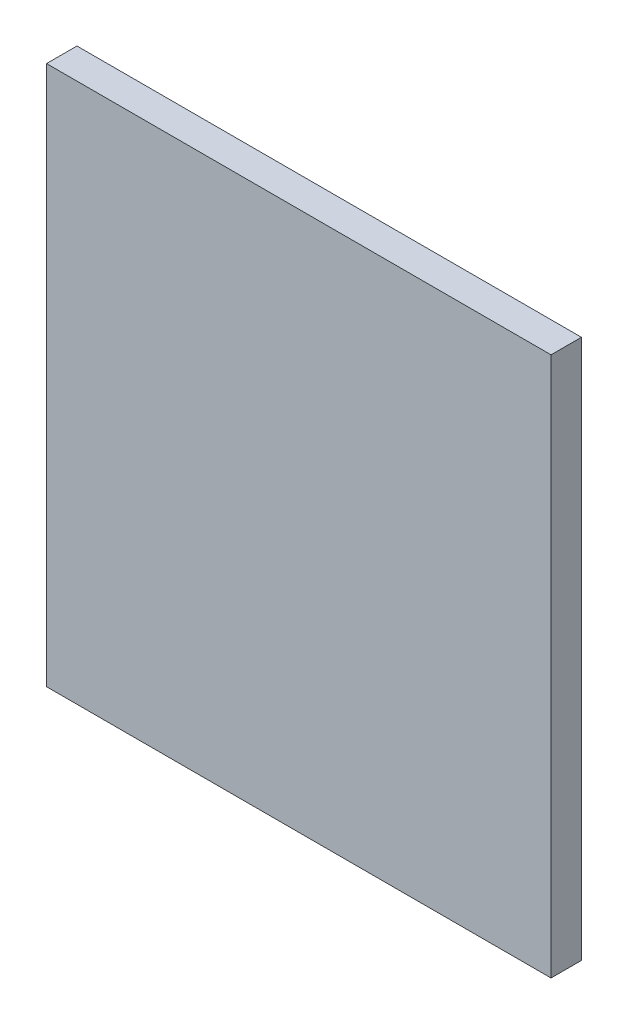
ISO-10303-21;
HEADER;
FILE_DESCRIPTION(('STEP AP214'),'2;1');
FILE_NAME('part.step','',(''),(''),'','','');
FILE_SCHEMA(('AUTOMOTIVE_DESIGN { 1 0 10303 214 1 1 1 1 }'));
ENDSEC;
DATA;
#1=APPLICATION_CONTEXT('core data for automotive mechanical design processes');
#2=APPLICATION_PROTOCOL_DEFINITION('international standard','automotive_design',2000,#1);
#3=PRODUCT_CONTEXT('',#1,'mechanical');
#4=PRODUCT('Part','Part','',(#3));
#5=PRODUCT_RELATED_PRODUCT_CATEGORY('part','',(#4));
#6=PRODUCT_DEFINITION_FORMATION('','',#4);
#7=PRODUCT_DEFINITION_CONTEXT('part definition',#1,'design');
#8=PRODUCT_DEFINITION('design','',#6,#7);
#9=PRODUCT_DEFINITION_SHAPE('','',#8);
#10=(LENGTH_UNIT() NAMED_UNIT(*) SI_UNIT(.MILLI.,.METRE.));
#11=(NAMED_UNIT(*) PLANE_ANGLE_UNIT() SI_UNIT($,.RADIAN.));
#12=(NAMED_UNIT(*) SI_UNIT($,.STERADIAN.) SOLID_ANGLE_UNIT());
#13=UNCERTAINTY_MEASURE_WITH_UNIT(LENGTH_MEASURE(1.E-05),#10,'distance_accuracy_value','');
#14=(GEOMETRIC_REPRESENTATION_CONTEXT(3) GLOBAL_UNCERTAINTY_ASSIGNED_CONTEXT((#13)) GLOBAL_UNIT_ASSIGNED_CONTEXT((#10,
#11,#12)) REPRESENTATION_CONTEXT('',''));
#15=CARTESIAN_POINT('',(0.,0.,0.));
#16=DIRECTION('',(0.,0.,1.));
#17=DIRECTION('',(1.,0.,0.));
#18=AXIS2_PLACEMENT_3D('',#15,#16,#17);
#19=CARTESIAN_POINT('',(0.,0.,1.9));
#20=DIRECTION('',(0.,1.,0.));
#21=DIRECTION('',(0.,0.,1.));
#22=AXIS2_PLACEMENT_3D('',#19,#20,#21);
#23=PLANE('',#22);
#24=DIRECTION('',(1.,0.,0.));
#25=VECTOR('',#24,1.);
#26=CARTESIAN_POINT('',(0.,0.,0.));
#27=LINE('',#26,#25);
#28=CARTESIAN_POINT('',(-15.76,0.,0.));
#29=VERTEX_POINT('',#28);
#30=CARTESIAN_POINT('',(15.76,0.,0.));
#31=VERTEX_POINT('',#30);
#32=EDGE_CURVE('E74',#29,#31,#27,.T.);
#33=ORIENTED_EDGE('',*,*,#32,.T.);
#34=DIRECTION('',(0.,0.,-1.));
#35=VECTOR('',#34,1.);
#36=CARTESIAN_POINT('',(15.76,0.,1.9));
#37=LINE('',#36,#35);
#38=CARTESIAN_POINT('',(15.76,0.,1.9));
#39=VERTEX_POINT('',#38);
#40=EDGE_CURVE('E11',#39,#31,#37,.T.);
#41=ORIENTED_EDGE('',*,*,#40,.F.);
#42=DIRECTION('',(1.,0.,0.));
#43=VECTOR('',#42,1.);
#44=CARTESIAN_POINT('',(-15.76,0.,1.9));
#45=LINE('',#44,#43);
#46=CARTESIAN_POINT('',(-15.76,0.,1.9));
#47=VERTEX_POINT('',#46);
#48=EDGE_CURVE('E79',#47,#39,#45,.T.);
#49=ORIENTED_EDGE('',*,*,#48,.F.);
#50=DIRECTION('',(0.,0.,-1.));
#51=VECTOR('',#50,1.);
#52=CARTESIAN_POINT('',(-15.76,0.,1.9));
#53=LINE('',#52,#51);
#54=EDGE_CURVE('E94',#47,#29,#53,.T.);
#55=ORIENTED_EDGE('',*,*,#54,.T.);
#56=EDGE_LOOP('',(#33,#41,#49,#55));
#57=FACE_BOUND('',#56,.T.);
#58=ADVANCED_FACE('F34',(#57),#23,.F.);
#59=CARTESIAN_POINT('',(15.76,0.,1.9));
#60=DIRECTION('',(-1.,0.,0.));
#61=DIRECTION('',(0.,0.,1.));
#62=AXIS2_PLACEMENT_3D('',#59,#60,#61);
#63=PLANE('',#62);
#64=DIRECTION('',(0.,1.,0.));
#65=VECTOR('',#64,1.);
#66=CARTESIAN_POINT('',(15.76,0.,0.));
#67=LINE('',#66,#65);
#68=CARTESIAN_POINT('',(15.76,33.72,0.));
#69=VERTEX_POINT('',#68);
#70=EDGE_CURVE('E90',#31,#69,#67,.T.);
#71=ORIENTED_EDGE('',*,*,#70,.T.);
#72=DIRECTION('',(0.,0.,-1.));
#73=VECTOR('',#72,1.);
#74=CARTESIAN_POINT('',(15.76,33.72,1.9));
#75=LINE('',#74,#73);
#76=CARTESIAN_POINT('',(15.76,33.72,1.9));
#77=VERTEX_POINT('',#76);
#78=EDGE_CURVE('E42',#77,#69,#75,.T.);
#79=ORIENTED_EDGE('',*,*,#78,.F.);
#80=DIRECTION('',(0.,1.,0.));
#81=VECTOR('',#80,1.);
#82=CARTESIAN_POINT('',(15.76,0.,1.9));
#83=LINE('',#82,#81);
#84=EDGE_CURVE('E82',#39,#77,#83,.T.);
#85=ORIENTED_EDGE('',*,*,#84,.F.);
#86=ORIENTED_EDGE('',*,*,#40,.T.);
#87=EDGE_LOOP('',(#71,#79,#85,#86));
#88=FACE_BOUND('',#87,.T.);
#89=ADVANCED_FACE('F89',(#88),#63,.F.);
#90=CARTESIAN_POINT('',(15.76,33.72,1.9));
#91=DIRECTION('',(0.,-1.,0.));
#92=DIRECTION('',(1.,0.,0.));
#93=AXIS2_PLACEMENT_3D('',#90,#91,#92);
#94=PLANE('',#93);
#95=DIRECTION('',(-1.,0.,0.));
#96=VECTOR('',#95,1.);
#97=CARTESIAN_POINT('',(15.76,33.72,0.));
#98=LINE('',#97,#96);
#99=CARTESIAN_POINT('',(-15.76,33.72,0.));
#100=VERTEX_POINT('',#99);
#101=EDGE_CURVE('E67',#69,#100,#98,.T.);
#102=ORIENTED_EDGE('',*,*,#101,.T.);
#103=DIRECTION('',(0.,0.,-1.));
#104=VECTOR('',#103,1.);
#105=CARTESIAN_POINT('',(-15.76,33.72,1.9));
#106=LINE('',#105,#104);
#107=CARTESIAN_POINT('',(-15.76,33.72,1.9));
#108=VERTEX_POINT('',#107);
#109=EDGE_CURVE('E91',#108,#100,#106,.T.);
#110=ORIENTED_EDGE('',*,*,#109,.F.);
#111=DIRECTION('',(-1.,0.,0.));
#112=VECTOR('',#111,1.);
#113=CARTESIAN_POINT('',(15.76,33.72,1.9));
#114=LINE('',#113,#112);
#115=EDGE_CURVE('E86',#77,#108,#114,.T.);
#116=ORIENTED_EDGE('',*,*,#115,.F.);
#117=ORIENTED_EDGE('',*,*,#78,.T.);
#118=EDGE_LOOP('',(#102,#110,#116,#117));
#119=FACE_BOUND('',#118,.T.);
#120=ADVANCED_FACE('F92',(#119),#94,.F.);
#121=CARTESIAN_POINT('',(-15.76,33.72,1.9));
#122=DIRECTION('',(1.,0.,0.));
#123=DIRECTION('',(0.,0.,-1.));
#124=AXIS2_PLACEMENT_3D('',#121,#122,#123);
#125=PLANE('',#124);
#126=DIRECTION('',(0.,-1.,0.));
#127=VECTOR('',#126,1.);
#128=CARTESIAN_POINT('',(-15.76,33.72,0.));
#129=LINE('',#128,#127);
#130=EDGE_CURVE('E101',#100,#29,#129,.T.);
#131=ORIENTED_EDGE('',*,*,#130,.T.);
#132=ORIENTED_EDGE('',*,*,#54,.F.);
#133=DIRECTION('',(0.,-1.,0.));
#134=VECTOR('',#133,1.);
#135=CARTESIAN_POINT('',(-15.76,33.72,1.9));
#136=LINE('',#135,#134);
#137=EDGE_CURVE('E50',#108,#47,#136,.T.);
#138=ORIENTED_EDGE('',*,*,#137,.F.);
#139=ORIENTED_EDGE('',*,*,#109,.T.);
#140=EDGE_LOOP('',(#131,#132,#138,#139));
#141=FACE_BOUND('',#140,.T.);
#142=ADVANCED_FACE('F106',(#141),#125,.F.);
#143=CARTESIAN_POINT('',(0.,0.,1.9));
#144=DIRECTION('',(0.,0.,1.));
#145=DIRECTION('',(1.,0.,0.));
#146=AXIS2_PLACEMENT_3D('',#143,#144,#145);
#147=PLANE('',#146);
#148=ORIENTED_EDGE('',*,*,#48,.T.);
#149=ORIENTED_EDGE('',*,*,#84,.T.);
#150=ORIENTED_EDGE('',*,*,#115,.T.);
#151=ORIENTED_EDGE('',*,*,#137,.T.);
#152=EDGE_LOOP('',(#148,#149,#150,#151));
#153=FACE_BOUND('',#152,.T.);
#154=ADVANCED_FACE('F84',(#153),#147,.T.);
#155=CARTESIAN_POINT('',(0.,0.,0.));
#156=DIRECTION('',(0.,0.,1.));
#157=DIRECTION('',(1.,0.,0.));
#158=AXIS2_PLACEMENT_3D('',#155,#156,#157);
#159=PLANE('',#158);
#160=ORIENTED_EDGE('',*,*,#32,.F.);
#161=ORIENTED_EDGE('',*,*,#130,.F.);
#162=ORIENTED_EDGE('',*,*,#101,.F.);
#163=ORIENTED_EDGE('',*,*,#70,.F.);
#164=EDGE_LOOP('',(#160,#161,#162,#163));
#165=FACE_BOUND('',#164,.T.);
#166=ADVANCED_FACE('F107',(#165),#159,.F.);
#167=CLOSED_SHELL('',(#58,#89,#120,#142,#154,#166));
#168=MANIFOLD_SOLID_BREP('B2',#167);
#169=ADVANCED_BREP_SHAPE_REPRESENTATION('',(#18,#168),#14);
#170=SHAPE_DEFINITION_REPRESENTATION(#9,#169);
ENDSEC;
END-ISO-10303-21;
